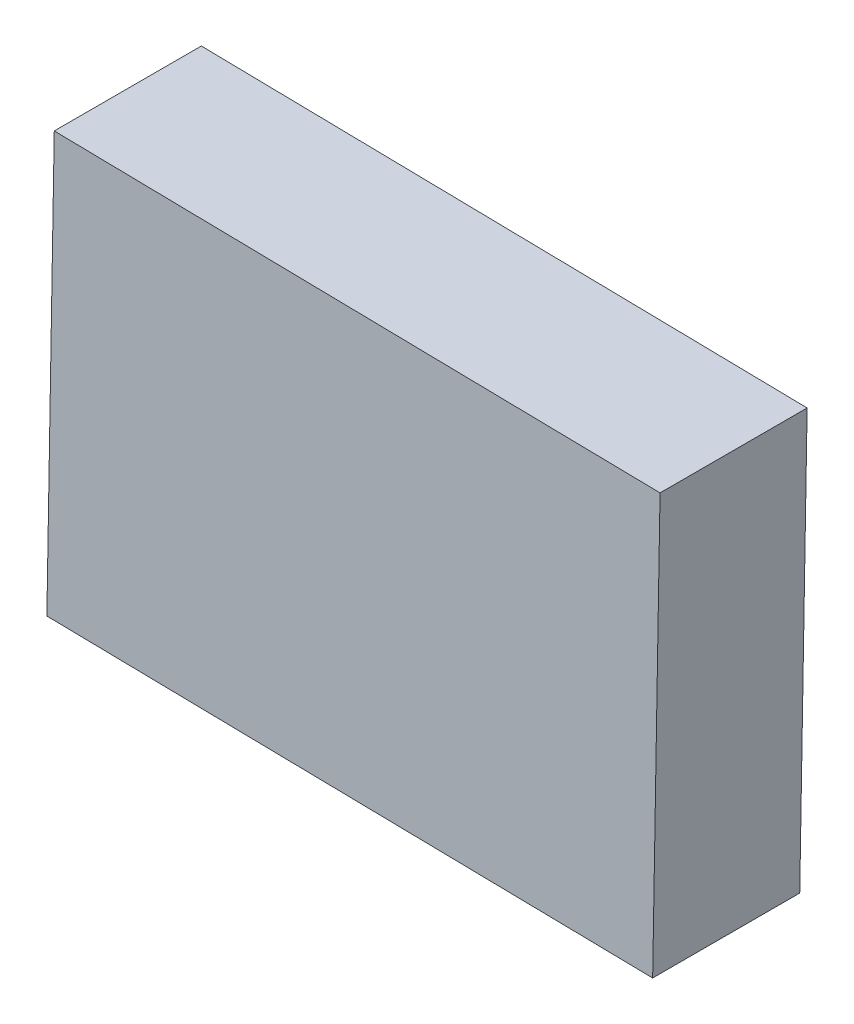
ISO-10303-21;
HEADER;
FILE_DESCRIPTION(('STEP AP214'),'2;1');
FILE_NAME('part.step','',(''),(''),'','','');
FILE_SCHEMA(('AUTOMOTIVE_DESIGN { 1 0 10303 214 1 1 1 1 }'));
ENDSEC;
DATA;
#1=APPLICATION_CONTEXT('core data for automotive mechanical design processes');
#2=APPLICATION_PROTOCOL_DEFINITION('international standard','automotive_design',2000,#1);
#3=PRODUCT_CONTEXT('',#1,'mechanical');
#4=PRODUCT('Part','Part','',(#3));
#5=PRODUCT_RELATED_PRODUCT_CATEGORY('part','',(#4));
#6=PRODUCT_DEFINITION_FORMATION('','',#4);
#7=PRODUCT_DEFINITION_CONTEXT('part definition',#1,'design');
#8=PRODUCT_DEFINITION('design','',#6,#7);
#9=PRODUCT_DEFINITION_SHAPE('','',#8);
#10=(LENGTH_UNIT() NAMED_UNIT(*) SI_UNIT(.MILLI.,.METRE.));
#11=(NAMED_UNIT(*) PLANE_ANGLE_UNIT() SI_UNIT($,.RADIAN.));
#12=(NAMED_UNIT(*) SI_UNIT($,.STERADIAN.) SOLID_ANGLE_UNIT());
#13=UNCERTAINTY_MEASURE_WITH_UNIT(LENGTH_MEASURE(1.E-05),#10,'distance_accuracy_value','');
#14=(GEOMETRIC_REPRESENTATION_CONTEXT(3) GLOBAL_UNCERTAINTY_ASSIGNED_CONTEXT((#13)) GLOBAL_UNIT_ASSIGNED_CONTEXT((#10,
#11,#12)) REPRESENTATION_CONTEXT('',''));
#15=CARTESIAN_POINT('',(0.,0.,0.));
#16=DIRECTION('',(0.,0.,1.));
#17=DIRECTION('',(1.,0.,0.));
#18=AXIS2_PLACEMENT_3D('',#15,#16,#17);
#19=CARTESIAN_POINT('',(41.2873486742219,38.3883881618117,0.391000000000008));
#20=DIRECTION('',(0.,0.,1.));
#21=DIRECTION('',(0.,-1.,0.));
#22=AXIS2_PLACEMENT_3D('',#19,#20,#21);
#23=PLANE('',#22);
#24=DIRECTION('',(-0.0174524064372826,-0.999847695156391,0.));
#25=VECTOR('',#24,1.);
#26=CARTESIAN_POINT('',(49.3026908983017,32.1057162702232,0.391000000000002));
#27=LINE('',#26,#25);
#28=CARTESIAN_POINT('',(49.2887096358856,31.3047302828519,0.391000000000002));
#29=VERTEX_POINT('',#28);
#30=CARTESIAN_POINT('',(49.3166721607179,32.9067022575946,0.391000000000003));
#31=VERTEX_POINT('',#30);
#32=EDGE_CURVE('E60',#29,#31,#27,.F.);
#33=ORIENTED_EDGE('',*,*,#32,.F.);
#34=DIRECTION('',(0.999847695156391,-0.0174524064372831,0.));
#35=VECTOR('',#34,1.);
#36=CARTESIAN_POINT('',(50.5110142526142,31.2833948764048,0.391000000000001));
#37=LINE('',#36,#35);
#38=CARTESIAN_POINT('',(51.5784615784511,31.2647625140249,0.391000000000001));
#39=VERTEX_POINT('',#38);
#40=EDGE_CURVE('E53',#39,#29,#37,.F.);
#41=ORIENTED_EDGE('',*,*,#40,.F.);
#42=DIRECTION('',(0.0174524064372731,0.999847695156391,0.));
#43=VECTOR('',#42,1.);
#44=CARTESIAN_POINT('',(51.5784615784511,31.2647625140249,0.391000000000002));
#45=LINE('',#44,#43);
#46=CARTESIAN_POINT('',(51.6064241032834,32.8667344887676,0.391000000000003));
#47=VERTEX_POINT('',#46);
#48=EDGE_CURVE('E20',#39,#47,#45,.T.);
#49=ORIENTED_EDGE('',*,*,#48,.T.);
#50=DIRECTION('',(-0.999847695156391,0.0174524064372831,0.));
#51=VECTOR('',#50,1.);
#52=CARTESIAN_POINT('',(50.5389767774465,32.8853668511475,0.391000000000004));
#53=LINE('',#52,#51);
#54=EDGE_CURVE('E58',#31,#47,#53,.F.);
#55=ORIENTED_EDGE('',*,*,#54,.F.);
#56=EDGE_LOOP('',(#33,#41,#49,#55));
#57=FACE_BOUND('',#56,.T.);
#58=ADVANCED_FACE('F17',(#57),#23,.T.);
#59=CARTESIAN_POINT('',(50.5389767774465,32.8853668511475,0.160378000000003));
#60=DIRECTION('',(0.0174524064372831,0.999847695156391,0.));
#61=DIRECTION('',(-0.999847695156391,0.0174524064372831,0.));
#62=AXIS2_PLACEMENT_3D('',#59,#60,#61);
#63=PLANE('',#62);
#64=DIRECTION('',(0.,0.,1.));
#65=VECTOR('',#64,1.);
#66=CARTESIAN_POINT('',(49.3166721607179,32.9067022575946,0.106970800000002));
#67=LINE('',#66,#65);
#68=CARTESIAN_POINT('',(49.3166721607179,32.9067022575946,-0.164920399999997));
#69=VERTEX_POINT('',#68);
#70=EDGE_CURVE('E66',#31,#69,#67,.F.);
#71=ORIENTED_EDGE('',*,*,#70,.F.);
#72=ORIENTED_EDGE('',*,*,#54,.T.);
#73=DIRECTION('',(0.,0.,1.));
#74=VECTOR('',#73,1.);
#75=CARTESIAN_POINT('',(51.6064241032835,32.8667344887676,-1.33139068486405));
#76=LINE('',#75,#74);
#77=CARTESIAN_POINT('',(51.6064241032834,32.8667344887676,-0.164920399999997));
#78=VERTEX_POINT('',#77);
#79=EDGE_CURVE('E80',#47,#78,#76,.F.);
#80=ORIENTED_EDGE('',*,*,#79,.T.);
#81=DIRECTION('',(-0.999847695156391,0.0174524064372882,0.));
#82=VECTOR('',#81,1.);
#83=CARTESIAN_POINT('',(51.6064241032834,32.8667344887676,-0.164920399999998));
#84=LINE('',#83,#82);
#85=EDGE_CURVE('E75',#78,#69,#84,.T.);
#86=ORIENTED_EDGE('',*,*,#85,.T.);
#87=EDGE_LOOP('',(#71,#72,#80,#86));
#88=FACE_BOUND('',#87,.T.);
#89=ADVANCED_FACE('F74',(#88),#63,.T.);
#90=CARTESIAN_POINT('',(49.3026908983017,32.1057162702232,0.106970800000002));
#91=DIRECTION('',(-0.999847695156391,0.0174524064372826,0.));
#92=DIRECTION('',(-0.0174524064372826,-0.999847695156391,0.));
#93=AXIS2_PLACEMENT_3D('',#90,#91,#92);
#94=PLANE('',#93);
#95=DIRECTION('',(0.,0.,1.));
#96=VECTOR('',#95,1.);
#97=CARTESIAN_POINT('',(49.2887096358856,31.3047302828519,0.160378000000002));
#98=LINE('',#97,#96);
#99=CARTESIAN_POINT('',(49.2887096358856,31.3047302828519,-0.164920399999998));
#100=VERTEX_POINT('',#99);
#101=EDGE_CURVE('E71',#29,#100,#98,.F.);
#102=ORIENTED_EDGE('',*,*,#101,.F.);
#103=ORIENTED_EDGE('',*,*,#32,.T.);
#104=ORIENTED_EDGE('',*,*,#70,.T.);
#105=DIRECTION('',(-0.017452406437273,-0.999847695156391,0.));
#106=VECTOR('',#105,1.);
#107=CARTESIAN_POINT('',(49.3166721607179,32.9067022575946,-0.164920399999998));
#108=LINE('',#107,#106);
#109=EDGE_CURVE('E84',#69,#100,#108,.T.);
#110=ORIENTED_EDGE('',*,*,#109,.T.);
#111=EDGE_LOOP('',(#102,#103,#104,#110));
#112=FACE_BOUND('',#111,.T.);
#113=ADVANCED_FACE('F68',(#112),#94,.T.);
#114=CARTESIAN_POINT('',(50.5110142526142,31.2833948764048,0.160378000000002));
#115=DIRECTION('',(-0.0174524064372831,-0.999847695156391,0.));
#116=DIRECTION('',(0.999847695156391,-0.0174524064372831,0.));
#117=AXIS2_PLACEMENT_3D('',#114,#115,#116);
#118=PLANE('',#117);
#119=ORIENTED_EDGE('',*,*,#101,.T.);
#120=DIRECTION('',(0.999847695156391,-0.0174524064372852,0.));
#121=VECTOR('',#120,1.);
#122=CARTESIAN_POINT('',(49.2887096358856,31.3047302828519,-0.164920399999999));
#123=LINE('',#122,#121);
#124=CARTESIAN_POINT('',(51.5784615784511,31.2647625140249,-0.164920399999999));
#125=VERTEX_POINT('',#124);
#126=EDGE_CURVE('E26',#100,#125,#123,.T.);
#127=ORIENTED_EDGE('',*,*,#126,.T.);
#128=DIRECTION('',(0.,0.,1.));
#129=VECTOR('',#128,1.);
#130=CARTESIAN_POINT('',(51.5784615784511,31.2647625140249,-1.33139068486405));
#131=LINE('',#130,#129);
#132=EDGE_CURVE('E34',#125,#39,#131,.T.);
#133=ORIENTED_EDGE('',*,*,#132,.T.);
#134=ORIENTED_EDGE('',*,*,#40,.T.);
#135=EDGE_LOOP('',(#119,#127,#133,#134));
#136=FACE_BOUND('',#135,.T.);
#137=ADVANCED_FACE('F88',(#136),#118,.T.);
#138=CARTESIAN_POINT('',(51.5924428408673,32.0657485013962,-1.33139068486405));
#139=DIRECTION('',(-0.999847695156391,0.0174524064372826,0.));
#140=DIRECTION('',(-0.0174524064372826,-0.999847695156391,0.));
#141=AXIS2_PLACEMENT_3D('',#138,#139,#140);
#142=PLANE('',#141);
#143=ORIENTED_EDGE('',*,*,#132,.F.);
#144=DIRECTION('',(0.0174524064372731,0.999847695156391,0.));
#145=VECTOR('',#144,1.);
#146=CARTESIAN_POINT('',(51.5784615784511,31.2647625140249,-0.164920399999999));
#147=LINE('',#146,#145);
#148=EDGE_CURVE('E11',#125,#78,#147,.T.);
#149=ORIENTED_EDGE('',*,*,#148,.T.);
#150=ORIENTED_EDGE('',*,*,#79,.F.);
#151=ORIENTED_EDGE('',*,*,#48,.F.);
#152=EDGE_LOOP('',(#143,#149,#150,#151));
#153=FACE_BOUND('',#152,.T.);
#154=ADVANCED_FACE('F91',(#153),#142,.F.);
#155=CARTESIAN_POINT('',(41.2873486742219,38.3883881618117,-0.164920399999993));
#156=DIRECTION('',(0.,0.,1.));
#157=DIRECTION('',(0.,-1.,0.));
#158=AXIS2_PLACEMENT_3D('',#155,#156,#157);
#159=PLANE('',#158);
#160=ORIENTED_EDGE('',*,*,#126,.F.);
#161=ORIENTED_EDGE('',*,*,#109,.F.);
#162=ORIENTED_EDGE('',*,*,#85,.F.);
#163=ORIENTED_EDGE('',*,*,#148,.F.);
#164=EDGE_LOOP('',(#160,#161,#162,#163));
#165=FACE_BOUND('',#164,.T.);
#166=ADVANCED_FACE('F90',(#165),#159,.F.);
#167=CLOSED_SHELL('',(#58,#89,#113,#137,#154,#166));
#168=MANIFOLD_SOLID_BREP('B1',#167);
#169=ADVANCED_BREP_SHAPE_REPRESENTATION('',(#18,#168),#14);
#170=SHAPE_DEFINITION_REPRESENTATION(#9,#169);
ENDSEC;
END-ISO-10303-21;
